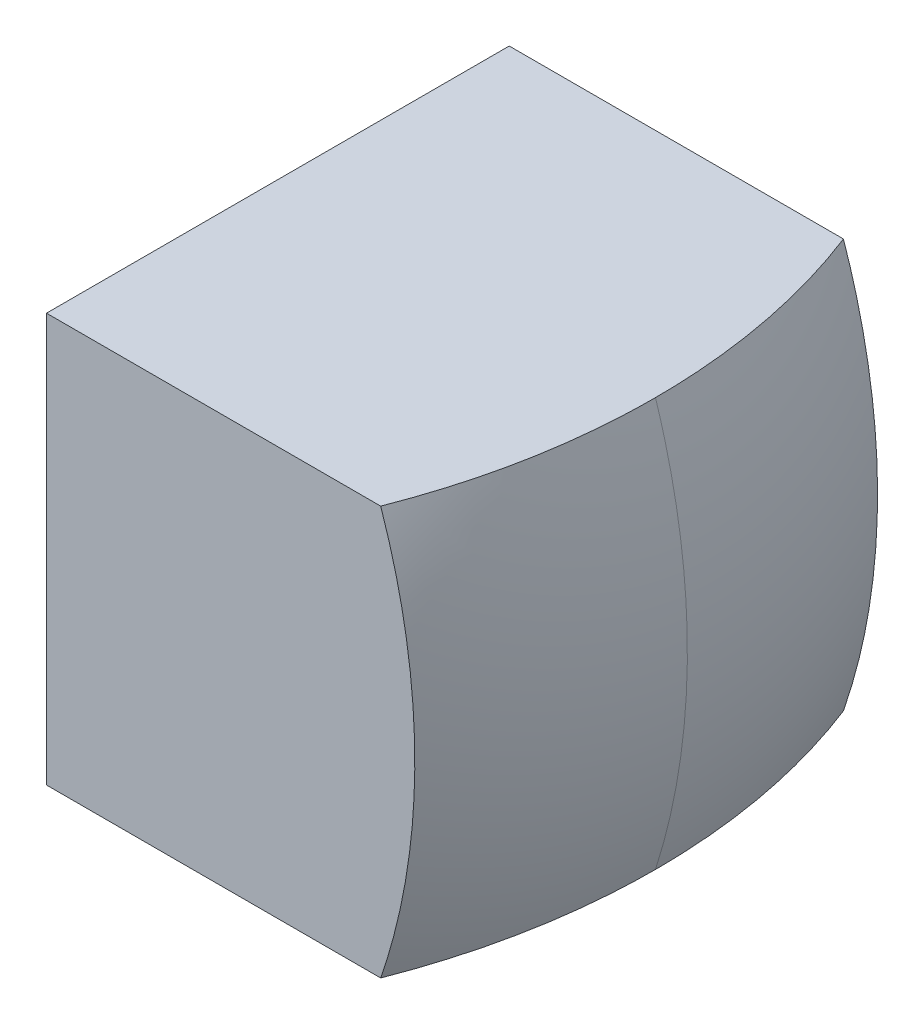
ISO-10303-21;
HEADER;
FILE_DESCRIPTION(('STEP AP214'),'2;1');
FILE_NAME('part.step','',(''),(''),'','','');
FILE_SCHEMA(('AUTOMOTIVE_DESIGN { 1 0 10303 214 1 1 1 1 }'));
ENDSEC;
DATA;
#1=APPLICATION_CONTEXT('core data for automotive mechanical design processes');
#2=APPLICATION_PROTOCOL_DEFINITION('international standard','automotive_design',2000,#1);
#3=PRODUCT_CONTEXT('',#1,'mechanical');
#4=PRODUCT('Part','Part','',(#3));
#5=PRODUCT_RELATED_PRODUCT_CATEGORY('part','',(#4));
#6=PRODUCT_DEFINITION_FORMATION('','',#4);
#7=PRODUCT_DEFINITION_CONTEXT('part definition',#1,'design');
#8=PRODUCT_DEFINITION('design','',#6,#7);
#9=PRODUCT_DEFINITION_SHAPE('','',#8);
#10=(LENGTH_UNIT() NAMED_UNIT(*) SI_UNIT(.MILLI.,.METRE.));
#11=(NAMED_UNIT(*) PLANE_ANGLE_UNIT() SI_UNIT($,.RADIAN.));
#12=(NAMED_UNIT(*) SI_UNIT($,.STERADIAN.) SOLID_ANGLE_UNIT());
#13=UNCERTAINTY_MEASURE_WITH_UNIT(LENGTH_MEASURE(1.E-05),#10,'distance_accuracy_value','');
#14=(GEOMETRIC_REPRESENTATION_CONTEXT(3) GLOBAL_UNCERTAINTY_ASSIGNED_CONTEXT((#13)) GLOBAL_UNIT_ASSIGNED_CONTEXT((#10,
#11,#12)) REPRESENTATION_CONTEXT('',''));
#15=CARTESIAN_POINT('',(0.,0.,0.));
#16=DIRECTION('',(0.,0.,1.));
#17=DIRECTION('',(1.,0.,0.));
#18=AXIS2_PLACEMENT_3D('',#15,#16,#17);
#19=CARTESIAN_POINT('',(46.0120116021939,4.26388404173715,25.2403300666775));
#20=CARTESIAN_POINT('',(43.0594225775192,4.26388404173715,25.2403300666775));
#21=CARTESIAN_POINT('',(46.0120116021939,4.26388404173715,21.657969933386));
#22=CARTESIAN_POINT('',(43.0594225775192,4.26388404173715,21.657969933386));
#23=(BOUNDED_SURFACE() B_SPLINE_SURFACE(1,1,((#19,#20),(#21,#22)),.UNSPECIFIED.,.F.,.F.,
.F.) B_SPLINE_SURFACE_WITH_KNOTS((2,2),(2,2),(6.74612821578504,10.3284883490766),
(0.10082079410062,0.337915628214132),
.UNSPECIFIED.) GEOMETRIC_REPRESENTATION_ITEM() RATIONAL_B_SPLINE_SURFACE(((1.,1.),(1.,1.))) REPRESENTATION_ITEM('') SURFACE());
#24=CARTESIAN_POINT('',(45.6467437334242,4.26388404173715,25.2403300666775));
#25=CARTESIAN_POINT('',(43.0594225775192,4.26388404173715,25.2403300666775));
#26=(BOUNDED_CURVE() B_SPLINE_CURVE(1,(#24,#25),.UNSPECIFIED.,.F.,
.F.) B_SPLINE_CURVE_WITH_KNOTS((2,2),(0.130152043397155,0.337915628214131),
.UNSPECIFIED.) CURVE() GEOMETRIC_REPRESENTATION_ITEM() RATIONAL_B_SPLINE_CURVE((1.,1.)) REPRESENTATION_ITEM(''));
#27=CARTESIAN_POINT('',(45.6467437334242,4.26388404173715,25.2403300666775));
#28=VERTEX_POINT('',#27);
#29=CARTESIAN_POINT('',(43.0594225775192,4.26388404173715,25.2403300666775));
#30=VERTEX_POINT('',#29);
#31=EDGE_CURVE('E43',#28,#30,#26,.T.);
#32=CARTESIAN_POINT('',(45.6467437334242,4.26388404173715,25.2403300666775));
#33=CARTESIAN_POINT('',(45.6746413466308,4.26388404173715,25.1686088595004));
#34=CARTESIAN_POINT('',(45.700912512818,4.26388404173715,25.0962517158941));
#35=CARTESIAN_POINT('',(45.7499325166477,4.26388404173715,24.9508739019608));
#36=CARTESIAN_POINT('',(45.7727029701814,4.26388404173715,24.8778605165126));
#37=CARTESIAN_POINT('',(45.8147229447049,4.26388404173715,24.7311699180544));
#38=CARTESIAN_POINT('',(45.833987348376,4.26388404173715,24.6574969733122));
#39=CARTESIAN_POINT('',(45.8690035312854,4.26388404173715,24.5094912530712));
#40=CARTESIAN_POINT('',(45.8847629152138,4.26388404173715,24.4351602772162));
#41=CARTESIAN_POINT('',(45.9127760227394,4.26388404173715,24.2858406461434));
#42=CARTESIAN_POINT('',(45.9250297463366,4.26388404173715,24.2108519909257));
#43=CARTESIAN_POINT('',(45.9460397426095,4.26388404173715,24.0602186402154));
#44=CARTESIAN_POINT('',(45.9547882754123,4.26388404173715,23.9845728656502));
#45=CARTESIAN_POINT('',(45.9687940539912,4.26388404173715,23.8326266643111));
#46=CARTESIAN_POINT('',(45.9740358820317,4.26388404173715,23.7563248212957));
#47=CARTESIAN_POINT('',(45.9810417965417,4.26388404173715,23.6030649546595));
#48=CARTESIAN_POINT('',(45.9827830965304,4.26388404173715,23.5261058858109));
#49=CARTESIAN_POINT('',(45.9827780474941,4.26388404173715,23.4491500000317));
#50=B_SPLINE_CURVE_WITH_KNOTS('',3,(#32,#33,#34,#35,#36,#37,#38,#39,#40,#41,#42,#43,#44,#45,#46,
#47,#48,#49),.UNSPECIFIED.,.F.,.F.,(4,2,2,2,2,2,2,2,4),(0.,0.230852412872536,0.460216566010723,
0.688583157748536,0.916449331105879,1.14431550446321,1.372682096201,1.60204624933913,
1.83289866221158),.UNSPECIFIED.);
#51=CARTESIAN_POINT('',(45.9827780474941,4.26388404173716,23.4491500000317));
#52=VERTEX_POINT('',#51);
#53=EDGE_CURVE('E11',#28,#52,#50,.T.);
#54=CARTESIAN_POINT('',(45.6467437334242,4.26388404173715,21.657969933386));
#55=CARTESIAN_POINT('',(45.9827780474941,4.26388404173715,22.5220391100582));
#56=CARTESIAN_POINT('',(45.9827780474941,4.26388404173715,23.4491500000317));
#57=(BOUNDED_CURVE() B_SPLINE_CURVE(2,(#54,#55,#56),.UNSPECIFIED.,.F.,
.F.) B_SPLINE_CURVE_WITH_KNOTS((3,3),(0.,0.0615457496856045),
.UNSPECIFIED.) CURVE() GEOMETRIC_REPRESENTATION_ITEM() RATIONAL_B_SPLINE_CURVE((0.805461343263285,
0.838539628741929,0.903701310809624)) REPRESENTATION_ITEM(''));
#58=CARTESIAN_POINT('',(45.6467437334242,4.26388404173715,21.657969933386));
#59=VERTEX_POINT('',#58);
#60=EDGE_CURVE('E214',#59,#52,#57,.T.);
#61=CARTESIAN_POINT('',(45.6467437334242,4.26388404173715,21.657969933386));
#62=CARTESIAN_POINT('',(43.0594225775192,4.26388404173715,21.657969933386));
#63=(BOUNDED_CURVE() B_SPLINE_CURVE(1,(#61,#62),.UNSPECIFIED.,.F.,
.F.) B_SPLINE_CURVE_WITH_KNOTS((2,2),(0.130152043397151,0.337915628214132),
.UNSPECIFIED.) CURVE() GEOMETRIC_REPRESENTATION_ITEM() RATIONAL_B_SPLINE_CURVE((1.,1.)) REPRESENTATION_ITEM(''));
#64=CARTESIAN_POINT('',(43.0594225775192,4.26388404173715,21.657969933386));
#65=VERTEX_POINT('',#64);
#66=EDGE_CURVE('E32',#59,#65,#63,.T.);
#67=CARTESIAN_POINT('',(43.0594225775192,4.26388404173714,25.2403300666775));
#68=CARTESIAN_POINT('',(43.0594225775192,4.26388404173715,21.657969933386));
#69=(BOUNDED_CURVE() B_SPLINE_CURVE(1,(#67,#68),.UNSPECIFIED.,.F.,
.F.) B_SPLINE_CURVE_WITH_KNOTS((2,2),(0.414525040693629,0.758527452940212),
.UNSPECIFIED.) CURVE() GEOMETRIC_REPRESENTATION_ITEM() RATIONAL_B_SPLINE_CURVE((1.,1.)) REPRESENTATION_ITEM(''));
#70=EDGE_CURVE('E90',#30,#65,#69,.T.);
#71=ORIENTED_EDGE('',*,*,#31,.F.);
#72=ORIENTED_EDGE('',*,*,#53,.T.);
#73=ORIENTED_EDGE('',*,*,#60,.F.);
#74=ORIENTED_EDGE('',*,*,#66,.T.);
#75=ORIENTED_EDGE('',*,*,#70,.F.);
#76=EDGE_LOOP('',(#71,#72,#73,#74,#75));
#77=FACE_BOUND('',#76,.T.);
#78=ADVANCED_FACE('F17',(#77),#23,.T.);
#79=CARTESIAN_POINT('',(45.9393417013263,4.26388404173714,21.657969933386));
#80=CARTESIAN_POINT('',(43.0594225775192,4.26388404173714,21.657969933386));
#81=CARTESIAN_POINT('',(45.9393417013263,1.10011595924363,21.657969933386));
#82=CARTESIAN_POINT('',(43.0594225775192,1.10011595924363,21.657969933386));
#83=(BOUNDED_SURFACE() B_SPLINE_SURFACE(1,1,((#79,#80),(#81,#82)),.UNSPECIFIED.,.F.,.F.,
.F.) B_SPLINE_SURFACE_WITH_KNOTS((2,2),(2,2),(10.3284883490766,13.4922564315701),
(0.106656234775653,0.337915628214131),
.UNSPECIFIED.) GEOMETRIC_REPRESENTATION_ITEM() RATIONAL_B_SPLINE_SURFACE(((1.,1.),(1.,1.))) REPRESENTATION_ITEM('') SURFACE());
#84=CARTESIAN_POINT('',(45.6467437334242,1.10011595924362,21.657969933386));
#85=CARTESIAN_POINT('',(45.667432030053,1.16034926591183,21.6579701809923));
#86=CARTESIAN_POINT('',(45.6869387587507,1.22098846557984,21.6579741225203));
#87=CARTESIAN_POINT('',(45.7237663441478,1.34367061487229,21.657985267631));
#88=CARTESIAN_POINT('',(45.7410601638995,1.40572168168642,21.6579925073851));
#89=CARTESIAN_POINT('',(45.7733347003169,1.53109134394267,21.6580059958857));
#90=CARTESIAN_POINT('',(45.7882902803927,1.59441641164722,21.6580122338802));
#91=CARTESIAN_POINT('',(45.8157737339597,1.72218536066797,21.6580211361173));
#92=CARTESIAN_POINT('',(45.828278642067,1.78663418264112,21.6580237678214));
#93=CARTESIAN_POINT('',(45.8507588871069,1.91649109406315,21.6580243325695));
#94=CARTESIAN_POINT('',(45.8607136632722,1.98190274351683,21.6580222286835));
#95=CARTESIAN_POINT('',(45.8780062471495,2.11351614416254,21.6580139237324));
#96=CARTESIAN_POINT('',(45.8853261072147,2.179720253732,21.6580076953595));
#97=CARTESIAN_POINT('',(45.8972771116387,2.31274149679189,21.6579939041749));
#98=CARTESIAN_POINT('',(45.9018930961486,2.37955999278361,21.6579863341435));
#99=CARTESIAN_POINT('',(45.9083808817966,2.51362634423263,21.6579738863895));
#100=CARTESIAN_POINT('',(45.910240445822,2.58087479104131,21.6579690207323));
#101=CARTESIAN_POINT('',(45.9111968308068,2.71827059619358,21.6579714313831));
#102=CARTESIAN_POINT('',(45.9101719929512,2.78841883272167,21.6579792363105));
#103=CARTESIAN_POINT('',(45.9051056514537,2.92828818610778,21.6579972810829));
#104=CARTESIAN_POINT('',(45.9010778213576,2.99800979920577,21.6580075097483));
#105=CARTESIAN_POINT('',(45.8900562680951,3.13684684893362,21.6580254363592));
#106=CARTESIAN_POINT('',(45.8830783570078,3.20596354071185,21.6580331474139));
#107=CARTESIAN_POINT('',(45.8662255937865,3.34338696888852,21.6580429223434));
#108=CARTESIAN_POINT('',(45.8563698580468,3.41169605006926,21.6580450225834));
#109=CARTESIAN_POINT('',(45.8338494227478,3.54730887561711,21.6580430420495));
#110=CARTESIAN_POINT('',(45.8212069451512,3.61461631089634,21.6580390087628));
#111=CARTESIAN_POINT('',(45.7932187666634,3.74804081429248,21.6580263994263));
#112=CARTESIAN_POINT('',(45.7778981501561,3.81416314518665,21.6580178641648));
#113=CARTESIAN_POINT('',(45.7446752112704,3.94504442130078,21.6579997122292));
#114=CARTESIAN_POINT('',(45.726800559384,4.00981039187941,21.657990107362));
#115=CARTESIAN_POINT('',(45.6886067967729,4.13782008036379,21.6579753967408));
#116=CARTESIAN_POINT('',(45.6683176185141,4.20107273032042,21.6579702413318));
#117=CARTESIAN_POINT('',(45.6467437334242,4.26388404173715,21.657969933386));
#118=B_SPLINE_CURVE_WITH_KNOTS('',3,(#84,#85,#86,#87,#88,#89,#90,#91,#92,#93,#94,#95,#96,#97,
#98,#99,#100,#101,#102,#103,#104,#105,#106,#107,#108,#109,#110,#111,#112,#113,#114,#115,#116,
#117),.UNSPECIFIED.,.F.,.F.,(4,2,2,2,2,2,2,2,2,2,2,2,2,2,2,2,4),(0.,0.191049479652557,
0.384246596641772,0.579395737847518,0.776294318435314,0.974733716365708,1.17450028357578,
1.3753764211288,1.57714170372141,1.78754302294231,1.996992126767,2.20533256329126,
2.41231938244948,2.61771180224437,2.82127452611554,3.02277898491908,3.22200448624347),.UNSPECIFIED.);
#119=CARTESIAN_POINT('',(45.6467437334242,1.10011595924363,21.657969933386));
#120=VERTEX_POINT('',#119);
#121=EDGE_CURVE('E189',#120,#59,#118,.T.);
#122=CARTESIAN_POINT('',(45.6467437334242,1.10011595924363,21.657969933386));
#123=CARTESIAN_POINT('',(43.0594225775192,1.10011595924363,21.657969933386));
#124=(BOUNDED_CURVE() B_SPLINE_CURVE(1,(#122,#123),.UNSPECIFIED.,.F.,
.F.) B_SPLINE_CURVE_WITH_KNOTS((2,2),(0.130152043397151,0.337915628214131),
.UNSPECIFIED.) CURVE() GEOMETRIC_REPRESENTATION_ITEM() RATIONAL_B_SPLINE_CURVE((1.,1.)) REPRESENTATION_ITEM(''));
#125=CARTESIAN_POINT('',(43.0594225775192,1.10011595924363,21.657969933386));
#126=VERTEX_POINT('',#125);
#127=EDGE_CURVE('E244',#120,#126,#124,.T.);
#128=CARTESIAN_POINT('',(43.0594225775192,4.26388404173715,21.657969933386));
#129=CARTESIAN_POINT('',(43.0594225775192,1.10011595924363,21.657969933386));
#130=(BOUNDED_CURVE() B_SPLINE_CURVE(1,(#128,#129),.UNSPECIFIED.,.F.,
.F.) B_SPLINE_CURVE_WITH_KNOTS((2,2),(0.37297367455752,0.62702632544248),
.UNSPECIFIED.) CURVE() GEOMETRIC_REPRESENTATION_ITEM() RATIONAL_B_SPLINE_CURVE((1.,1.)) REPRESENTATION_ITEM(''));
#131=EDGE_CURVE('E84',#65,#126,#130,.T.);
#132=ORIENTED_EDGE('',*,*,#66,.F.);
#133=ORIENTED_EDGE('',*,*,#121,.F.);
#134=ORIENTED_EDGE('',*,*,#127,.T.);
#135=ORIENTED_EDGE('',*,*,#131,.F.);
#136=EDGE_LOOP('',(#132,#133,#134,#135));
#137=FACE_BOUND('',#136,.T.);
#138=ADVANCED_FACE('F142',(#137),#83,.T.);
#139=CARTESIAN_POINT('',(46.0120116021939,1.10011595924363,21.657969933386));
#140=CARTESIAN_POINT('',(43.0594225775192,1.10011595924363,21.657969933386));
#141=CARTESIAN_POINT('',(46.0120116021939,1.10011595924363,25.2403300666775));
#142=CARTESIAN_POINT('',(43.0594225775192,1.10011595924363,25.2403300666775));
#143=(BOUNDED_SURFACE() B_SPLINE_SURFACE(1,1,((#139,#140),(#141,#142)),.UNSPECIFIED.,.F.,.F.,
.F.) B_SPLINE_SURFACE_WITH_KNOTS((2,2),(2,2),(0.,3.58236013329152),(0.100820794100618,
0.337915628214131),
.UNSPECIFIED.) GEOMETRIC_REPRESENTATION_ITEM() RATIONAL_B_SPLINE_SURFACE(((1.,1.),(1.,1.))) REPRESENTATION_ITEM('') SURFACE());
#144=CARTESIAN_POINT('',(45.6467437334242,1.10011595924363,21.657969933386));
#145=CARTESIAN_POINT('',(45.6746413466308,1.10011595924363,21.729691140563));
#146=CARTESIAN_POINT('',(45.700912512818,1.10011595924363,21.8020482841692));
#147=CARTESIAN_POINT('',(45.7499325166477,1.10011595924363,21.9474260981024));
#148=CARTESIAN_POINT('',(45.7727029701814,1.10011595924363,22.0204394835506));
#149=CARTESIAN_POINT('',(45.8147229447049,1.10011595924363,22.1671300820087));
#150=CARTESIAN_POINT('',(45.833987348376,1.10011595924363,22.2408030267509));
#151=CARTESIAN_POINT('',(45.8690035312854,1.10011595924363,22.3888087469918));
#152=CARTESIAN_POINT('',(45.8847629152138,1.10011595924363,22.4631397228468));
#153=CARTESIAN_POINT('',(45.9127760227394,1.10011595924363,22.6124593539196));
#154=CARTESIAN_POINT('',(45.9250297463366,1.10011595924363,22.6874480091373));
#155=CARTESIAN_POINT('',(45.9460397426095,1.10011595924363,22.8380813598476));
#156=CARTESIAN_POINT('',(45.9547882754123,1.10011595924363,22.9137271344129));
#157=CARTESIAN_POINT('',(45.9687940539912,1.10011595924363,23.0656733357521));
#158=CARTESIAN_POINT('',(45.9740358820317,1.10011595924363,23.1419751787675));
#159=CARTESIAN_POINT('',(45.9810417965417,1.10011595924363,23.2952350454038));
#160=CARTESIAN_POINT('',(45.9827830965304,1.10011595924363,23.3721941142524));
#161=CARTESIAN_POINT('',(45.9827780474941,1.10011595924363,23.4491500000317));
#162=B_SPLINE_CURVE_WITH_KNOTS('',3,(#144,#145,#146,#147,#148,#149,#150,#151,#152,#153,#154,
#155,#156,#157,#158,#159,#160,#161),.UNSPECIFIED.,.F.,.F.,(4,2,2,2,2,2,2,2,4),(0.,
0.230852412872346,0.460216566010393,0.688583157748118,0.916449331105427,1.14431550446277,
1.37268209620062,1.60204624933887,1.8328986622115),.UNSPECIFIED.);
#163=CARTESIAN_POINT('',(45.9827780474941,1.10011595924362,23.4491500000317));
#164=VERTEX_POINT('',#163);
#165=EDGE_CURVE('E188',#120,#164,#162,.T.);
#166=CARTESIAN_POINT('',(45.6467437334242,1.10011595924362,25.2403300666775));
#167=CARTESIAN_POINT('',(45.9827780474941,1.10011595924362,24.3762608900052));
#168=CARTESIAN_POINT('',(45.9827780474941,1.10011595924362,23.4491500000317));
#169=(BOUNDED_CURVE() B_SPLINE_CURVE(2,(#166,#167,#168),.UNSPECIFIED.,.F.,
.F.) B_SPLINE_CURVE_WITH_KNOTS((3,3),(0.938454250314391,1.),
.UNSPECIFIED.) CURVE() GEOMETRIC_REPRESENTATION_ITEM() RATIONAL_B_SPLINE_CURVE((0.80546134326328,
0.838539628741924,0.903701310809624)) REPRESENTATION_ITEM(''));
#170=CARTESIAN_POINT('',(45.6467437334242,1.10011595924363,25.2403300666775));
#171=VERTEX_POINT('',#170);
#172=EDGE_CURVE('E74',#171,#164,#169,.T.);
#173=CARTESIAN_POINT('',(45.6467437334242,1.10011595924363,25.2403300666775));
#174=CARTESIAN_POINT('',(43.0594225775192,1.10011595924363,25.2403300666775));
#175=(BOUNDED_CURVE() B_SPLINE_CURVE(1,(#173,#174),.UNSPECIFIED.,.F.,
.F.) B_SPLINE_CURVE_WITH_KNOTS((2,2),(0.130152043397154,0.337915628214131),
.UNSPECIFIED.) CURVE() GEOMETRIC_REPRESENTATION_ITEM() RATIONAL_B_SPLINE_CURVE((1.,1.)) REPRESENTATION_ITEM(''));
#176=CARTESIAN_POINT('',(43.0594225775192,1.10011595924363,25.2403300666775));
#177=VERTEX_POINT('',#176);
#178=EDGE_CURVE('E180',#171,#177,#175,.T.);
#179=CARTESIAN_POINT('',(43.0594225775192,1.10011595924363,21.657969933386));
#180=CARTESIAN_POINT('',(43.0594225775192,1.10011595924363,25.2403300666775));
#181=(BOUNDED_CURVE() B_SPLINE_CURVE(1,(#179,#180),.UNSPECIFIED.,.F.,
.F.) B_SPLINE_CURVE_WITH_KNOTS((2,2),(0.241472547059788,0.58547495930637),
.UNSPECIFIED.) CURVE() GEOMETRIC_REPRESENTATION_ITEM() RATIONAL_B_SPLINE_CURVE((1.,1.)) REPRESENTATION_ITEM(''));
#182=EDGE_CURVE('E108',#126,#177,#181,.T.);
#183=ORIENTED_EDGE('',*,*,#127,.F.);
#184=ORIENTED_EDGE('',*,*,#165,.T.);
#185=ORIENTED_EDGE('',*,*,#172,.F.);
#186=ORIENTED_EDGE('',*,*,#178,.T.);
#187=ORIENTED_EDGE('',*,*,#182,.F.);
#188=EDGE_LOOP('',(#183,#184,#185,#186,#187));
#189=FACE_BOUND('',#188,.T.);
#190=ADVANCED_FACE('F19',(#189),#143,.T.);
#191=CARTESIAN_POINT('',(45.9827780474941,1.10011595924362,23.4491500000317));
#192=CARTESIAN_POINT('',(46.2297864218097,1.87177302111177,23.4491500000317));
#193=CARTESIAN_POINT('',(46.2297864218097,2.68200000049039,23.4491500000317));
#194=CARTESIAN_POINT('',(46.2297864218097,3.49222697986901,23.4491500000317));
#195=CARTESIAN_POINT('',(45.9827780474941,4.26388404173715,23.4491500000317));
#196=CARTESIAN_POINT('',(45.9827780474941,1.10011595924362,22.5220391100582));
#197=CARTESIAN_POINT('',(46.2297864218097,1.87177302111177,22.4756991070745));
#198=CARTESIAN_POINT('',(46.2297864218097,2.68200000049039,22.4756991070745));
#199=CARTESIAN_POINT('',(46.2297864218097,3.49222697986901,22.4756991070745));
#200=CARTESIAN_POINT('',(45.9827780474941,4.26388404173715,22.5220391100582));
#201=CARTESIAN_POINT('',(45.6467437334242,1.10011595924362,21.657969933386));
#202=CARTESIAN_POINT('',(45.8769560251082,1.87177302111177,21.5684409562913));
#203=CARTESIAN_POINT('',(45.8769560251082,2.68200000049039,21.5684409562913));
#204=CARTESIAN_POINT('',(45.8769560251082,3.49222697986901,21.5684409562913));
#205=CARTESIAN_POINT('',(45.6467437334242,4.26388404173715,21.657969933386));
#206=(BOUNDED_SURFACE() B_SPLINE_SURFACE(2,2,((#191,#192,#193,#194,#195),(#196,#197,#198,#199,
#200),(#201,#202,#203,#204,#205)),.UNSPECIFIED.,.F.,.F.,.F.) B_SPLINE_SURFACE_WITH_KNOTS((3,3),
(3,2,3),(0.,0.0615457496856045),(0.396294099901306,0.5,0.603705900098694),
.UNSPECIFIED.) GEOMETRIC_REPRESENTATION_ITEM() RATIONAL_B_SPLINE_SURFACE(((0.903701310809624,
0.939250490220294,1.,0.939250490220294,0.903701310809624),(0.838539628741929,0.871525522807301,
0.927894669081185,0.871525522807301,0.838539628741929),(0.805461343263285,0.837146026529234,
0.891291551344187,0.837146026529234,0.805461343263285))) REPRESENTATION_ITEM('') SURFACE());
#207=CARTESIAN_POINT('',(45.9827780474941,1.10011595924362,23.4491500000317));
#208=CARTESIAN_POINT('',(46.2297864218097,1.87177302111177,23.4491500000317));
#209=CARTESIAN_POINT('',(46.2297864218097,2.68200000049039,23.4491500000317));
#210=CARTESIAN_POINT('',(46.2297864218097,3.49222697986901,23.4491500000317));
#211=CARTESIAN_POINT('',(45.9827780474941,4.26388404173716,23.4491500000317));
#212=(BOUNDED_CURVE() B_SPLINE_CURVE(2,(#207,#208,#209,#210,#211),.UNSPECIFIED.,.F.,
.F.) B_SPLINE_CURVE_WITH_KNOTS((3,2,3),(0.396294099901306,0.5,0.603705900098694),
.UNSPECIFIED.) CURVE() GEOMETRIC_REPRESENTATION_ITEM() RATIONAL_B_SPLINE_CURVE((0.903701310809624,
0.939250490220294,1.,0.939250490220294,0.903701310809624)) REPRESENTATION_ITEM(''));
#213=EDGE_CURVE('E104',#164,#52,#212,.T.);
#214=ORIENTED_EDGE('',*,*,#213,.F.);
#215=ORIENTED_EDGE('',*,*,#165,.F.);
#216=ORIENTED_EDGE('',*,*,#121,.T.);
#217=ORIENTED_EDGE('',*,*,#60,.T.);
#218=EDGE_LOOP('',(#214,#215,#216,#217));
#219=FACE_BOUND('',#218,.T.);
#220=ADVANCED_FACE('F246',(#219),#206,.T.);
#221=CARTESIAN_POINT('',(45.6467437334242,1.10011595924362,25.2403300666775));
#222=CARTESIAN_POINT('',(45.8769560251082,1.87177302111177,25.3298590437722));
#223=CARTESIAN_POINT('',(45.8769560251082,2.68200000049039,25.3298590437722));
#224=CARTESIAN_POINT('',(45.8769560251082,3.49222697986901,25.3298590437722));
#225=CARTESIAN_POINT('',(45.6467437334242,4.26388404173715,25.2403300666775));
#226=CARTESIAN_POINT('',(45.9827780474941,1.10011595924362,24.3762608900052));
#227=CARTESIAN_POINT('',(46.2297864218097,1.87177302111177,24.4226008929889));
#228=CARTESIAN_POINT('',(46.2297864218097,2.68200000049039,24.4226008929889));
#229=CARTESIAN_POINT('',(46.2297864218097,3.49222697986901,24.4226008929889));
#230=CARTESIAN_POINT('',(45.9827780474941,4.26388404173715,24.3762608900052));
#231=CARTESIAN_POINT('',(45.9827780474941,1.10011595924362,23.4491500000317));
#232=CARTESIAN_POINT('',(46.2297864218097,1.87177302111177,23.4491500000317));
#233=CARTESIAN_POINT('',(46.2297864218097,2.68200000049039,23.4491500000317));
#234=CARTESIAN_POINT('',(46.2297864218097,3.49222697986901,23.4491500000317));
#235=CARTESIAN_POINT('',(45.9827780474941,4.26388404173715,23.4491500000317));
#236=(BOUNDED_SURFACE() B_SPLINE_SURFACE(2,2,((#221,#222,#223,#224,#225),(#226,#227,#228,#229,
#230),(#231,#232,#233,#234,#235)),.UNSPECIFIED.,.F.,.F.,.F.) B_SPLINE_SURFACE_WITH_KNOTS((3,3),
(3,2,3),(0.938454250314391,1.),(0.396294099901306,0.5,0.603705900098694),
.UNSPECIFIED.) GEOMETRIC_REPRESENTATION_ITEM() RATIONAL_B_SPLINE_SURFACE(((0.80546134326328,
0.837146026529229,0.891291551344181,0.837146026529229,0.80546134326328),(0.838539628741924,
0.871525522807296,0.92789466908118,0.871525522807296,0.838539628741925),(0.903701310809624,
0.939250490220294,1.,0.939250490220294,0.903701310809624))) REPRESENTATION_ITEM('') SURFACE());
#237=CARTESIAN_POINT('',(45.6467437334242,4.26388404173715,25.2403300666775));
#238=CARTESIAN_POINT('',(45.6674320300659,4.20365073503144,25.2403298190711));
#239=CARTESIAN_POINT('',(45.6869387587753,4.1430115353255,25.2403258775424));
#240=CARTESIAN_POINT('',(45.7237663441895,4.02032938596792,25.2403147324294));
#241=CARTESIAN_POINT('',(45.7410601639471,3.95827831912673,25.2403074926737));
#242=CARTESIAN_POINT('',(45.7733347003715,3.83290865682727,25.2402940041696));
#243=CARTESIAN_POINT('',(45.7882902804487,3.76958358910669,25.2402877661732));
#244=CARTESIAN_POINT('',(45.8157737340147,3.64181464006484,25.2402788639325));
#245=CARTESIAN_POINT('',(45.8282786421201,3.57736581808672,25.2402762322268));
#246=CARTESIAN_POINT('',(45.8507588871536,3.44750890666559,25.240275667476));
#247=CARTESIAN_POINT('',(45.8607136633148,3.38209725721787,25.2402777713611));
#248=CARTESIAN_POINT('',(45.8780062471828,3.2504838565947,25.2402860763116));
#249=CARTESIAN_POINT('',(45.885326107243,3.18427974704187,25.2402923046848));
#250=CARTESIAN_POINT('',(45.897277111657,3.05125850402544,25.2403060958715));
#251=CARTESIAN_POINT('',(45.9018930961623,2.98444000806059,25.2403136659047));
#252=CARTESIAN_POINT('',(45.9083808818019,2.85037365667498,25.240326113665));
#253=CARTESIAN_POINT('',(45.9102404458239,2.78312520990285,25.2403309793267));
#254=CARTESIAN_POINT('',(45.9111968308053,2.64572940475034,25.2403285686851));
#255=CARTESIAN_POINT('',(45.9101719929467,2.57558116818542,25.2403207637624));
#256=CARTESIAN_POINT('',(45.9051056514412,2.43571181473536,25.2403027189966));
#257=CARTESIAN_POINT('',(45.9010778213407,2.36599020161024,25.2402924903331));
#258=CARTESIAN_POINT('',(45.8900562680683,2.22715315183844,25.2402745637244));
#259=CARTESIAN_POINT('',(45.883078356976,2.15803646004336,25.2402668526701));
#260=CARTESIAN_POINT('',(45.8662255937451,2.02061303184382,25.2402570777399));
#261=CARTESIAN_POINT('',(45.8563698580013,1.952303950657,25.240254977499));
#262=CARTESIAN_POINT('',(45.8338494226955,1.81669112510812,25.2402569580301));
#263=CARTESIAN_POINT('',(45.8212069450968,1.74938368983386,25.240260991315));
#264=CARTESIAN_POINT('',(45.7932187666077,1.61595918645898,25.2402736006478));
#265=CARTESIAN_POINT('',(45.7778981501016,1.54983685558099,25.2402821359073));
#266=CARTESIAN_POINT('',(45.7446752112226,1.41895557951051,25.2403002878392));
#267=CARTESIAN_POINT('',(45.7268005593421,1.35418960895924,25.2403098927047));
#268=CARTESIAN_POINT('',(45.6886067967481,1.22617992054072,25.2403246033234));
#269=CARTESIAN_POINT('',(45.6683176185011,1.16292727062244,25.2403297587317));
#270=CARTESIAN_POINT('',(45.6467437334242,1.10011595924362,25.2403300666775));
#271=B_SPLINE_CURVE_WITH_KNOTS('',3,(#237,#238,#239,#240,#241,#242,#243,#244,#245,#246,#247,
#248,#249,#250,#251,#252,#253,#254,#255,#256,#257,#258,#259,#260,#261,#262,#263,#264,#265,#266,
#267,#268,#269,#270),.UNSPECIFIED.,.F.,.F.,(4,2,2,2,2,2,2,2,2,2,2,2,2,2,2,2,4),(0.,
0.191049479771518,0.384246596843671,0.579395738097164,0.77629431869848,0.974733716609375,
1.17450028376826,1.37537642123994,1.57714170372271,1.78754302305412,1.99699212696083,
2.20533256353684,2.41231938271491,2.61771180249631,2.82127452631938,3.02277898503918,
3.22200448624334),.UNSPECIFIED.);
#272=EDGE_CURVE('E101',#28,#171,#271,.T.);
#273=ORIENTED_EDGE('',*,*,#272,.T.);
#274=ORIENTED_EDGE('',*,*,#172,.T.);
#275=ORIENTED_EDGE('',*,*,#213,.T.);
#276=ORIENTED_EDGE('',*,*,#53,.F.);
#277=EDGE_LOOP('',(#273,#274,#275,#276));
#278=FACE_BOUND('',#277,.T.);
#279=ADVANCED_FACE('F143',(#278),#236,.T.);
#280=CARTESIAN_POINT('',(45.9393417013262,1.10011595924363,25.2403300666775));
#281=CARTESIAN_POINT('',(43.0594225775192,1.10011595924363,25.2403300666775));
#282=CARTESIAN_POINT('',(45.9393417013262,4.26388404173715,25.2403300666775));
#283=CARTESIAN_POINT('',(43.0594225775192,4.26388404173715,25.2403300666775));
#284=(BOUNDED_SURFACE() B_SPLINE_SURFACE(1,1,((#280,#281),(#282,#283)),.UNSPECIFIED.,.F.,.F.,
.F.) B_SPLINE_SURFACE_WITH_KNOTS((2,2),(2,2),(3.58236013329152,6.74612821578504),
(0.106656234775658,0.337915628214132),
.UNSPECIFIED.) GEOMETRIC_REPRESENTATION_ITEM() RATIONAL_B_SPLINE_SURFACE(((1.,1.),(1.,1.))) REPRESENTATION_ITEM('') SURFACE());
#285=CARTESIAN_POINT('',(43.0594225775192,1.10011595924363,25.2403300666775));
#286=CARTESIAN_POINT('',(43.0594225775192,4.26388404173715,25.2403300666775));
#287=(BOUNDED_CURVE() B_SPLINE_CURVE(1,(#285,#286),.UNSPECIFIED.,.F.,
.F.) B_SPLINE_CURVE_WITH_KNOTS((2,2),(0.37297367455752,0.62702632544248),
.UNSPECIFIED.) CURVE() GEOMETRIC_REPRESENTATION_ITEM() RATIONAL_B_SPLINE_CURVE((1.,1.)) REPRESENTATION_ITEM(''));
#288=EDGE_CURVE('E100',#177,#30,#287,.T.);
#289=ORIENTED_EDGE('',*,*,#178,.F.);
#290=ORIENTED_EDGE('',*,*,#272,.F.);
#291=ORIENTED_EDGE('',*,*,#31,.T.);
#292=ORIENTED_EDGE('',*,*,#288,.F.);
#293=EDGE_LOOP('',(#289,#290,#291,#292));
#294=FACE_BOUND('',#293,.T.);
#295=ADVANCED_FACE('F99',(#294),#284,.T.);
#296=CARTESIAN_POINT('',(43.0594225775192,1.10011595924362,25.2403300666775));
#297=CARTESIAN_POINT('',(43.0594225775192,1.10011595924362,21.657969933386));
#298=CARTESIAN_POINT('',(43.0594225775192,4.26388404173715,25.2403300666775));
#299=CARTESIAN_POINT('',(43.0594225775192,4.26388404173715,21.657969933386));
#300=(BOUNDED_SURFACE() B_SPLINE_SURFACE(1,1,((#296,#297),(#298,#299)),.UNSPECIFIED.,.F.,.F.,
.F.) B_SPLINE_SURFACE_WITH_KNOTS((2,2),(2,2),(0.37297367455752,0.62702632544248),
(17.5926647808948,21.1750249141863),
.UNSPECIFIED.) GEOMETRIC_REPRESENTATION_ITEM() RATIONAL_B_SPLINE_SURFACE(((1.,1.),(1.,1.))) REPRESENTATION_ITEM('') SURFACE());
#301=ORIENTED_EDGE('',*,*,#70,.T.);
#302=ORIENTED_EDGE('',*,*,#131,.T.);
#303=ORIENTED_EDGE('',*,*,#182,.T.);
#304=ORIENTED_EDGE('',*,*,#288,.T.);
#305=EDGE_LOOP('',(#301,#302,#303,#304));
#306=FACE_BOUND('',#305,.T.);
#307=ADVANCED_FACE('F106',(#306),#300,.T.);
#308=CLOSED_SHELL('',(#78,#138,#190,#220,#279,#295,#307));
#309=MANIFOLD_SOLID_BREP('B1',#308);
#310=ADVANCED_BREP_SHAPE_REPRESENTATION('',(#18,#309),#14);
#311=SHAPE_DEFINITION_REPRESENTATION(#9,#310);
ENDSEC;
END-ISO-10303-21;
